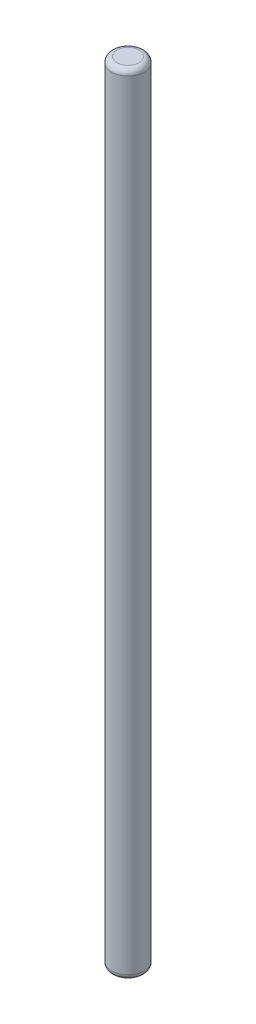
ISO-10303-21;
HEADER;
FILE_DESCRIPTION(('STEP AP214'),'2;1');
FILE_NAME('part.step','',(''),(''),'','','');
FILE_SCHEMA(('AUTOMOTIVE_DESIGN { 1 0 10303 214 1 1 1 1 }'));
ENDSEC;
DATA;
#1=APPLICATION_CONTEXT('core data for automotive mechanical design processes');
#2=APPLICATION_PROTOCOL_DEFINITION('international standard','automotive_design',2000,#1);
#3=PRODUCT_CONTEXT('',#1,'mechanical');
#4=PRODUCT('Part','Part','',(#3));
#5=PRODUCT_RELATED_PRODUCT_CATEGORY('part','',(#4));
#6=PRODUCT_DEFINITION_FORMATION('','',#4);
#7=PRODUCT_DEFINITION_CONTEXT('part definition',#1,'design');
#8=PRODUCT_DEFINITION('design','',#6,#7);
#9=PRODUCT_DEFINITION_SHAPE('','',#8);
#10=(LENGTH_UNIT() NAMED_UNIT(*) SI_UNIT(.MILLI.,.METRE.));
#11=(NAMED_UNIT(*) PLANE_ANGLE_UNIT() SI_UNIT($,.RADIAN.));
#12=(NAMED_UNIT(*) SI_UNIT($,.STERADIAN.) SOLID_ANGLE_UNIT());
#13=UNCERTAINTY_MEASURE_WITH_UNIT(LENGTH_MEASURE(1.E-05),#10,'distance_accuracy_value','');
#14=(GEOMETRIC_REPRESENTATION_CONTEXT(3) GLOBAL_UNCERTAINTY_ASSIGNED_CONTEXT((#13)) GLOBAL_UNIT_ASSIGNED_CONTEXT((#10,
#11,#12)) REPRESENTATION_CONTEXT('',''));
#15=CARTESIAN_POINT('',(0.,0.,0.));
#16=DIRECTION('',(0.,0.,1.));
#17=DIRECTION('',(1.,0.,0.));
#18=AXIS2_PLACEMENT_3D('',#15,#16,#17);
#19=CARTESIAN_POINT('',(0.,0.5,0.));
#20=DIRECTION('',(0.,1.,0.));
#21=DIRECTION('',(0.,0.,1.));
#22=AXIS2_PLACEMENT_3D('',#19,#20,#21);
#23=TOROIDAL_SURFACE('',#22,1.,0.5);
#24=CARTESIAN_POINT('',(0.,0.,0.));
#25=DIRECTION('',(0.,1.,0.));
#26=DIRECTION('',(0.,0.,1.));
#27=AXIS2_PLACEMENT_3D('',#24,#25,#26);
#28=CIRCLE('',#27,1.);
#29=CARTESIAN_POINT('',(0.,0.,1.));
#30=VERTEX_POINT('',#29);
#31=EDGE_CURVE('E43',#30,#30,#28,.F.);
#32=ORIENTED_EDGE('',*,*,#31,.F.);
#33=EDGE_LOOP('',(#32));
#34=FACE_BOUND('',#33,.T.);
#35=CARTESIAN_POINT('',(0.,0.5,0.));
#36=DIRECTION('',(0.,1.,0.));
#37=DIRECTION('',(0.,0.,1.));
#38=AXIS2_PLACEMENT_3D('',#35,#36,#37);
#39=CIRCLE('',#38,1.5);
#40=CARTESIAN_POINT('',(0.,0.5,1.5));
#41=VERTEX_POINT('',#40);
#42=EDGE_CURVE('E10',#41,#41,#39,.T.);
#43=ORIENTED_EDGE('',*,*,#42,.F.);
#44=EDGE_LOOP('',(#43));
#45=FACE_BOUND('',#44,.T.);
#46=ADVANCED_FACE('F37',(#34,#45),#23,.T.);
#47=CARTESIAN_POINT('',(0.,71.5,0.));
#48=DIRECTION('',(0.,1.,0.));
#49=DIRECTION('',(0.,0.,1.));
#50=AXIS2_PLACEMENT_3D('',#47,#48,#49);
#51=TOROIDAL_SURFACE('',#50,1.,0.5);
#52=CARTESIAN_POINT('',(0.,72.,0.));
#53=DIRECTION('',(0.,1.,0.));
#54=DIRECTION('',(0.,0.,1.));
#55=AXIS2_PLACEMENT_3D('',#52,#53,#54);
#56=CIRCLE('',#55,1.);
#57=CARTESIAN_POINT('',(0.,72.,1.));
#58=VERTEX_POINT('',#57);
#59=EDGE_CURVE('E51',#58,#58,#56,.T.);
#60=ORIENTED_EDGE('',*,*,#59,.F.);
#61=EDGE_LOOP('',(#60));
#62=FACE_BOUND('',#61,.T.);
#63=CARTESIAN_POINT('',(0.,71.5,0.));
#64=DIRECTION('',(0.,1.,0.));
#65=DIRECTION('',(0.,0.,1.));
#66=AXIS2_PLACEMENT_3D('',#63,#64,#65);
#67=CIRCLE('',#66,1.5);
#68=CARTESIAN_POINT('',(0.,71.5,1.5));
#69=VERTEX_POINT('',#68);
#70=EDGE_CURVE('E47',#69,#69,#67,.F.);
#71=ORIENTED_EDGE('',*,*,#70,.F.);
#72=EDGE_LOOP('',(#71));
#73=FACE_BOUND('',#72,.T.);
#74=ADVANCED_FACE('F59',(#62,#73),#51,.T.);
#75=CARTESIAN_POINT('',(0.,72.,0.));
#76=DIRECTION('',(0.,-1.,0.));
#77=DIRECTION('',(0.,0.,-1.));
#78=AXIS2_PLACEMENT_3D('',#75,#76,#77);
#79=CYLINDRICAL_SURFACE('',#78,1.5);
#80=ORIENTED_EDGE('',*,*,#42,.T.);
#81=EDGE_LOOP('',(#80));
#82=FACE_BOUND('',#81,.T.);
#83=ORIENTED_EDGE('',*,*,#70,.T.);
#84=EDGE_LOOP('',(#83));
#85=FACE_BOUND('',#84,.T.);
#86=ADVANCED_FACE('F62',(#82,#85),#79,.T.);
#87=CARTESIAN_POINT('',(0.,72.,0.));
#88=DIRECTION('',(0.,1.,0.));
#89=DIRECTION('',(0.,0.,1.));
#90=AXIS2_PLACEMENT_3D('',#87,#88,#89);
#91=PLANE('',#90);
#92=ORIENTED_EDGE('',*,*,#59,.T.);
#93=EDGE_LOOP('',(#92));
#94=FACE_BOUND('',#93,.T.);
#95=ADVANCED_FACE('F57',(#94),#91,.T.);
#96=CARTESIAN_POINT('',(0.,0.,0.));
#97=DIRECTION('',(0.,1.,0.));
#98=DIRECTION('',(0.,0.,1.));
#99=AXIS2_PLACEMENT_3D('',#96,#97,#98);
#100=PLANE('',#99);
#101=ORIENTED_EDGE('',*,*,#31,.T.);
#102=EDGE_LOOP('',(#101));
#103=FACE_BOUND('',#102,.T.);
#104=ADVANCED_FACE('F72',(#103),#100,.F.);
#105=CLOSED_SHELL('',(#46,#74,#86,#95,#104));
#106=MANIFOLD_SOLID_BREP('B2',#105);
#107=ADVANCED_BREP_SHAPE_REPRESENTATION('',(#18,#106),#14);
#108=SHAPE_DEFINITION_REPRESENTATION(#9,#107);
ENDSEC;
END-ISO-10303-21;
